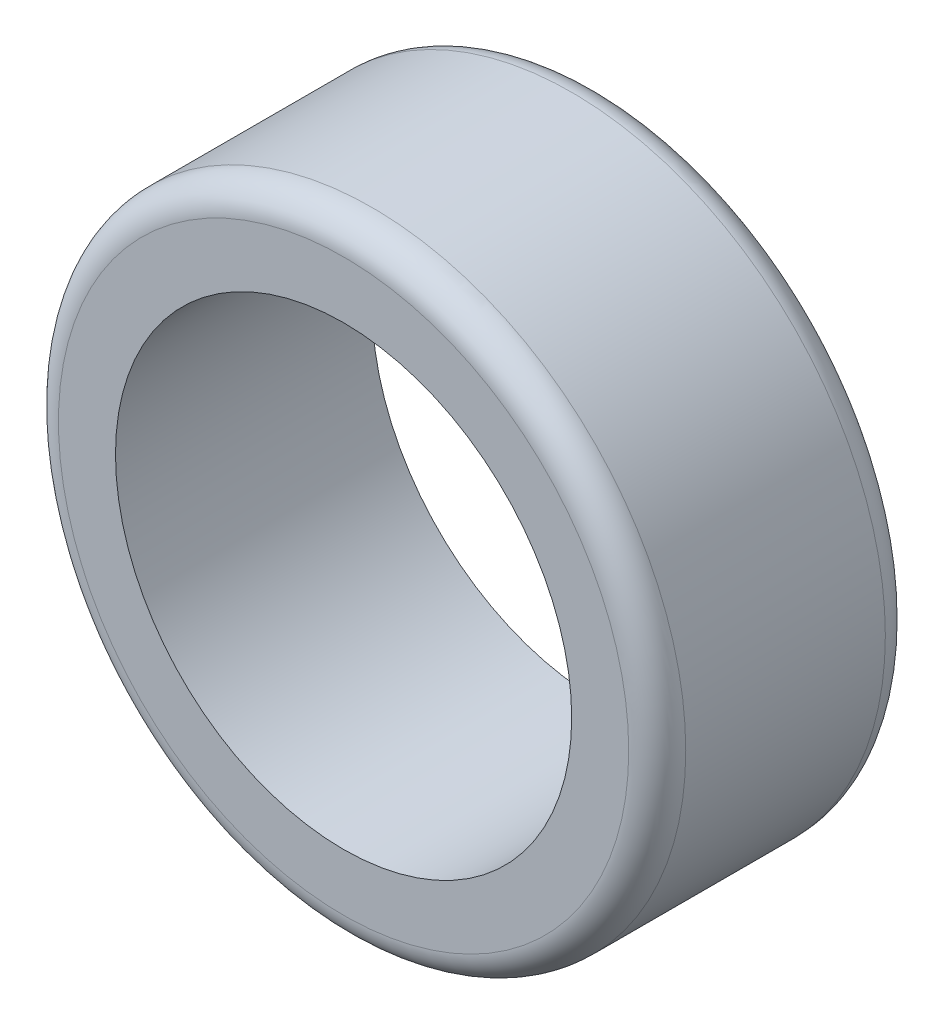
ISO-10303-21;
HEADER;
FILE_DESCRIPTION(('STEP AP214'),'2;1');
FILE_NAME('part.step','',(''),(''),'','','');
FILE_SCHEMA(('AUTOMOTIVE_DESIGN { 1 0 10303 214 1 1 1 1 }'));
ENDSEC;
DATA;
#1=APPLICATION_CONTEXT('core data for automotive mechanical design processes');
#2=APPLICATION_PROTOCOL_DEFINITION('international standard','automotive_design',2000,#1);
#3=PRODUCT_CONTEXT('',#1,'mechanical');
#4=PRODUCT('Part','Part','',(#3));
#5=PRODUCT_RELATED_PRODUCT_CATEGORY('part','',(#4));
#6=PRODUCT_DEFINITION_FORMATION('','',#4);
#7=PRODUCT_DEFINITION_CONTEXT('part definition',#1,'design');
#8=PRODUCT_DEFINITION('design','',#6,#7);
#9=PRODUCT_DEFINITION_SHAPE('','',#8);
#10=(LENGTH_UNIT() NAMED_UNIT(*) SI_UNIT(.MILLI.,.METRE.));
#11=(NAMED_UNIT(*) PLANE_ANGLE_UNIT() SI_UNIT($,.RADIAN.));
#12=(NAMED_UNIT(*) SI_UNIT($,.STERADIAN.) SOLID_ANGLE_UNIT());
#13=UNCERTAINTY_MEASURE_WITH_UNIT(LENGTH_MEASURE(1.E-05),#10,'distance_accuracy_value','');
#14=(GEOMETRIC_REPRESENTATION_CONTEXT(3) GLOBAL_UNCERTAINTY_ASSIGNED_CONTEXT((#13)) GLOBAL_UNIT_ASSIGNED_CONTEXT((#10,
#11,#12)) REPRESENTATION_CONTEXT('',''));
#15=CARTESIAN_POINT('',(0.,0.,0.));
#16=DIRECTION('',(0.,0.,1.));
#17=DIRECTION('',(1.,0.,0.));
#18=AXIS2_PLACEMENT_3D('',#15,#16,#17);
#19=CARTESIAN_POINT('',(0.,0.,9.));
#20=DIRECTION('',(0.,0.,1.));
#21=DIRECTION('',(1.,0.,0.));
#22=AXIS2_PLACEMENT_3D('',#19,#20,#21);
#23=PLANE('',#22);
#24=CARTESIAN_POINT('',(0.,0.,9.));
#25=DIRECTION('',(0.,0.,1.));
#26=DIRECTION('',(1.,0.,0.));
#27=AXIS2_PLACEMENT_3D('',#24,#25,#26);
#28=CIRCLE('',#27,10.);
#29=CARTESIAN_POINT('',(10.,0.,9.));
#30=VERTEX_POINT('',#29);
#31=EDGE_CURVE('E10',#30,#30,#28,.T.);
#32=ORIENTED_EDGE('',*,*,#31,.T.);
#33=EDGE_LOOP('',(#32));
#34=FACE_BOUND('',#33,.T.);
#35=CARTESIAN_POINT('',(0.,0.,9.));
#36=DIRECTION('',(0.,0.,1.));
#37=DIRECTION('',(1.,0.,0.));
#38=AXIS2_PLACEMENT_3D('',#35,#36,#37);
#39=CIRCLE('',#38,8.);
#40=CARTESIAN_POINT('',(8.,0.,9.));
#41=VERTEX_POINT('',#40);
#42=EDGE_CURVE('E57',#41,#41,#39,.T.);
#43=ORIENTED_EDGE('',*,*,#42,.F.);
#44=EDGE_LOOP('',(#43));
#45=FACE_BOUND('',#44,.T.);
#46=ADVANCED_FACE('F37',(#34,#45),#23,.T.);
#47=CARTESIAN_POINT('',(0.,0.,0.));
#48=DIRECTION('',(0.,0.,1.));
#49=DIRECTION('',(1.,0.,0.));
#50=AXIS2_PLACEMENT_3D('',#47,#48,#49);
#51=PLANE('',#50);
#52=CARTESIAN_POINT('',(0.,0.,0.));
#53=DIRECTION('',(0.,0.,1.));
#54=DIRECTION('',(1.,0.,0.));
#55=AXIS2_PLACEMENT_3D('',#52,#53,#54);
#56=CIRCLE('',#55,10.);
#57=CARTESIAN_POINT('',(10.,0.,0.));
#58=VERTEX_POINT('',#57);
#59=EDGE_CURVE('E44',#58,#58,#56,.F.);
#60=ORIENTED_EDGE('',*,*,#59,.T.);
#61=EDGE_LOOP('',(#60));
#62=FACE_BOUND('',#61,.T.);
#63=CARTESIAN_POINT('',(0.,0.,0.));
#64=DIRECTION('',(0.,0.,1.));
#65=DIRECTION('',(1.,0.,0.));
#66=AXIS2_PLACEMENT_3D('',#63,#64,#65);
#67=CIRCLE('',#66,8.);
#68=CARTESIAN_POINT('',(8.,0.,0.));
#69=VERTEX_POINT('',#68);
#70=EDGE_CURVE('E58',#69,#69,#67,.T.);
#71=ORIENTED_EDGE('',*,*,#70,.T.);
#72=EDGE_LOOP('',(#71));
#73=FACE_BOUND('',#72,.T.);
#74=ADVANCED_FACE('F68',(#62,#73),#51,.F.);
#75=CARTESIAN_POINT('',(0.,0.,9.));
#76=DIRECTION('',(0.,0.,-1.));
#77=DIRECTION('',(-1.,0.,0.));
#78=AXIS2_PLACEMENT_3D('',#75,#76,#77);
#79=CYLINDRICAL_SURFACE('',#78,11.);
#80=CARTESIAN_POINT('',(0.,0.,0.999999999999999));
#81=DIRECTION('',(0.,0.,1.));
#82=DIRECTION('',(1.,0.,0.));
#83=AXIS2_PLACEMENT_3D('',#80,#81,#82);
#84=CIRCLE('',#83,11.);
#85=CARTESIAN_POINT('',(11.,0.,0.999999999999999));
#86=VERTEX_POINT('',#85);
#87=EDGE_CURVE('E48',#86,#86,#84,.T.);
#88=ORIENTED_EDGE('',*,*,#87,.T.);
#89=EDGE_LOOP('',(#88));
#90=FACE_BOUND('',#89,.T.);
#91=CARTESIAN_POINT('',(0.,0.,8.));
#92=DIRECTION('',(0.,0.,1.));
#93=DIRECTION('',(1.,0.,0.));
#94=AXIS2_PLACEMENT_3D('',#91,#92,#93);
#95=CIRCLE('',#94,11.);
#96=CARTESIAN_POINT('',(11.,0.,8.));
#97=VERTEX_POINT('',#96);
#98=EDGE_CURVE('E52',#97,#97,#95,.F.);
#99=ORIENTED_EDGE('',*,*,#98,.T.);
#100=EDGE_LOOP('',(#99));
#101=FACE_BOUND('',#100,.T.);
#102=ADVANCED_FACE('F74',(#90,#101),#79,.T.);
#103=CARTESIAN_POINT('',(0.,0.,9.));
#104=DIRECTION('',(0.,0.,-1.));
#105=DIRECTION('',(-1.,0.,0.));
#106=AXIS2_PLACEMENT_3D('',#103,#104,#105);
#107=CYLINDRICAL_SURFACE('',#106,8.);
#108=ORIENTED_EDGE('',*,*,#42,.T.);
#109=EDGE_LOOP('',(#108));
#110=FACE_BOUND('',#109,.T.);
#111=ORIENTED_EDGE('',*,*,#70,.F.);
#112=EDGE_LOOP('',(#111));
#113=FACE_BOUND('',#112,.T.);
#114=ADVANCED_FACE('F64',(#110,#113),#107,.F.);
#115=CARTESIAN_POINT('',(0.,0.,0.999999999999999));
#116=DIRECTION('',(0.,0.,1.));
#117=DIRECTION('',(1.,0.,0.));
#118=AXIS2_PLACEMENT_3D('',#115,#116,#117);
#119=TOROIDAL_SURFACE('',#118,10.,1.);
#120=ORIENTED_EDGE('',*,*,#59,.F.);
#121=EDGE_LOOP('',(#120));
#122=FACE_BOUND('',#121,.T.);
#123=ORIENTED_EDGE('',*,*,#87,.F.);
#124=EDGE_LOOP('',(#123));
#125=FACE_BOUND('',#124,.T.);
#126=ADVANCED_FACE('F80',(#122,#125),#119,.T.);
#127=CARTESIAN_POINT('',(0.,0.,8.));
#128=DIRECTION('',(0.,0.,1.));
#129=DIRECTION('',(1.,0.,0.));
#130=AXIS2_PLACEMENT_3D('',#127,#128,#129);
#131=TOROIDAL_SURFACE('',#130,10.,1.);
#132=ORIENTED_EDGE('',*,*,#98,.F.);
#133=EDGE_LOOP('',(#132));
#134=FACE_BOUND('',#133,.T.);
#135=ORIENTED_EDGE('',*,*,#31,.F.);
#136=EDGE_LOOP('',(#135));
#137=FACE_BOUND('',#136,.T.);
#138=ADVANCED_FACE('F39',(#134,#137),#131,.T.);
#139=CLOSED_SHELL('',(#46,#74,#102,#114,#126,#138));
#140=MANIFOLD_SOLID_BREP('B2',#139);
#141=ADVANCED_BREP_SHAPE_REPRESENTATION('',(#18,#140),#14);
#142=SHAPE_DEFINITION_REPRESENTATION(#9,#141);
ENDSEC;
END-ISO-10303-21;
